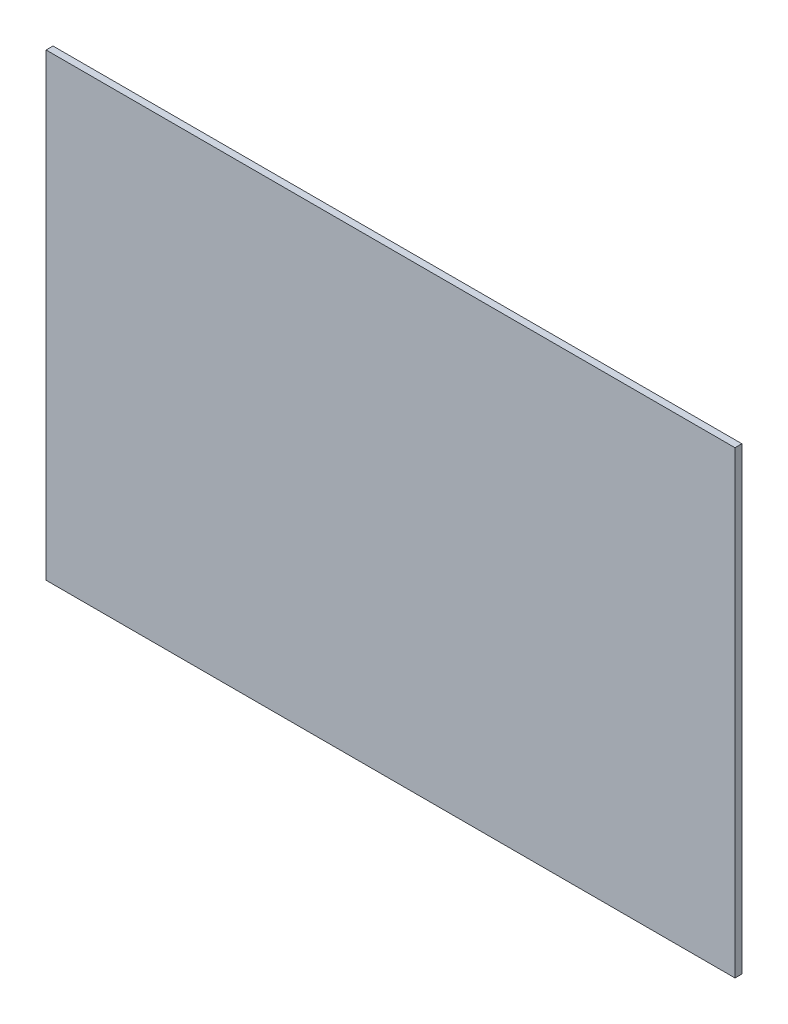
ISO-10303-21;
HEADER;
FILE_DESCRIPTION(('STEP AP214'),'2;1');
FILE_NAME('part.step','',(''),(''),'','','');
FILE_SCHEMA(('AUTOMOTIVE_DESIGN { 1 0 10303 214 1 1 1 1 }'));
ENDSEC;
DATA;
#1=APPLICATION_CONTEXT('core data for automotive mechanical design processes');
#2=APPLICATION_PROTOCOL_DEFINITION('international standard','automotive_design',2000,#1);
#3=PRODUCT_CONTEXT('',#1,'mechanical');
#4=PRODUCT('Part','Part','',(#3));
#5=PRODUCT_RELATED_PRODUCT_CATEGORY('part','',(#4));
#6=PRODUCT_DEFINITION_FORMATION('','',#4);
#7=PRODUCT_DEFINITION_CONTEXT('part definition',#1,'design');
#8=PRODUCT_DEFINITION('design','',#6,#7);
#9=PRODUCT_DEFINITION_SHAPE('','',#8);
#10=(LENGTH_UNIT() NAMED_UNIT(*) SI_UNIT(.MILLI.,.METRE.));
#11=(NAMED_UNIT(*) PLANE_ANGLE_UNIT() SI_UNIT($,.RADIAN.));
#12=(NAMED_UNIT(*) SI_UNIT($,.STERADIAN.) SOLID_ANGLE_UNIT());
#13=UNCERTAINTY_MEASURE_WITH_UNIT(LENGTH_MEASURE(1.E-05),#10,'distance_accuracy_value','');
#14=(GEOMETRIC_REPRESENTATION_CONTEXT(3) GLOBAL_UNCERTAINTY_ASSIGNED_CONTEXT((#13)) GLOBAL_UNIT_ASSIGNED_CONTEXT((#10,
#11,#12)) REPRESENTATION_CONTEXT('',''));
#15=CARTESIAN_POINT('',(0.,0.,0.));
#16=DIRECTION('',(0.,0.,1.));
#17=DIRECTION('',(1.,0.,0.));
#18=AXIS2_PLACEMENT_3D('',#15,#16,#17);
#19=CARTESIAN_POINT('',(0.,0.,6.));
#20=DIRECTION('',(1.,0.,0.));
#21=DIRECTION('',(0.,0.,-1.));
#22=AXIS2_PLACEMENT_3D('',#19,#20,#21);
#23=PLANE('',#22);
#24=DIRECTION('',(0.,-1.,0.));
#25=VECTOR('',#24,1.);
#26=CARTESIAN_POINT('',(0.,0.,0.));
#27=LINE('',#26,#25);
#28=CARTESIAN_POINT('',(0.,400.,0.));
#29=VERTEX_POINT('',#28);
#30=CARTESIAN_POINT('',(0.,0.,0.));
#31=VERTEX_POINT('',#30);
#32=EDGE_CURVE('E98',#29,#31,#27,.T.);
#33=ORIENTED_EDGE('',*,*,#32,.T.);
#34=DIRECTION('',(0.,0.,-1.));
#35=VECTOR('',#34,1.);
#36=CARTESIAN_POINT('',(0.,0.,6.));
#37=LINE('',#36,#35);
#38=CARTESIAN_POINT('',(0.,0.,6.));
#39=VERTEX_POINT('',#38);
#40=EDGE_CURVE('E11',#39,#31,#37,.T.);
#41=ORIENTED_EDGE('',*,*,#40,.F.);
#42=DIRECTION('',(0.,-1.,0.));
#43=VECTOR('',#42,1.);
#44=CARTESIAN_POINT('',(0.,0.,6.));
#45=LINE('',#44,#43);
#46=CARTESIAN_POINT('',(0.,400.,6.));
#47=VERTEX_POINT('',#46);
#48=EDGE_CURVE('E86',#47,#39,#45,.T.);
#49=ORIENTED_EDGE('',*,*,#48,.F.);
#50=DIRECTION('',(0.,0.,-1.));
#51=VECTOR('',#50,1.);
#52=CARTESIAN_POINT('',(0.,400.,6.));
#53=LINE('',#52,#51);
#54=EDGE_CURVE('E94',#47,#29,#53,.T.);
#55=ORIENTED_EDGE('',*,*,#54,.T.);
#56=EDGE_LOOP('',(#33,#41,#49,#55));
#57=FACE_BOUND('',#56,.T.);
#58=ADVANCED_FACE('F35',(#57),#23,.F.);
#59=CARTESIAN_POINT('',(0.,0.,6.));
#60=DIRECTION('',(0.,1.,0.));
#61=DIRECTION('',(0.,0.,1.));
#62=AXIS2_PLACEMENT_3D('',#59,#60,#61);
#63=PLANE('',#62);
#64=DIRECTION('',(1.,0.,0.));
#65=VECTOR('',#64,1.);
#66=CARTESIAN_POINT('',(0.,0.,0.));
#67=LINE('',#66,#65);
#68=CARTESIAN_POINT('',(600.,0.,0.));
#69=VERTEX_POINT('',#68);
#70=EDGE_CURVE('E90',#31,#69,#67,.T.);
#71=ORIENTED_EDGE('',*,*,#70,.T.);
#72=DIRECTION('',(0.,0.,-1.));
#73=VECTOR('',#72,1.);
#74=CARTESIAN_POINT('',(600.,0.,6.));
#75=LINE('',#74,#73);
#76=CARTESIAN_POINT('',(600.,0.,6.));
#77=VERTEX_POINT('',#76);
#78=EDGE_CURVE('E43',#77,#69,#75,.T.);
#79=ORIENTED_EDGE('',*,*,#78,.F.);
#80=DIRECTION('',(1.,0.,0.));
#81=VECTOR('',#80,1.);
#82=CARTESIAN_POINT('',(0.,0.,6.));
#83=LINE('',#82,#81);
#84=EDGE_CURVE('E81',#39,#77,#83,.T.);
#85=ORIENTED_EDGE('',*,*,#84,.F.);
#86=ORIENTED_EDGE('',*,*,#40,.T.);
#87=EDGE_LOOP('',(#71,#79,#85,#86));
#88=FACE_BOUND('',#87,.T.);
#89=ADVANCED_FACE('F89',(#88),#63,.F.);
#90=CARTESIAN_POINT('',(600.,0.,6.));
#91=DIRECTION('',(-1.,0.,0.));
#92=DIRECTION('',(0.,0.,1.));
#93=AXIS2_PLACEMENT_3D('',#90,#91,#92);
#94=PLANE('',#93);
#95=DIRECTION('',(0.,1.,0.));
#96=VECTOR('',#95,1.);
#97=CARTESIAN_POINT('',(600.,0.,0.));
#98=LINE('',#97,#96);
#99=CARTESIAN_POINT('',(600.,400.,0.));
#100=VERTEX_POINT('',#99);
#101=EDGE_CURVE('E68',#69,#100,#98,.T.);
#102=ORIENTED_EDGE('',*,*,#101,.T.);
#103=DIRECTION('',(0.,0.,-1.));
#104=VECTOR('',#103,1.);
#105=CARTESIAN_POINT('',(600.,400.,6.));
#106=LINE('',#105,#104);
#107=CARTESIAN_POINT('',(600.,400.,6.));
#108=VERTEX_POINT('',#107);
#109=EDGE_CURVE('E91',#108,#100,#106,.T.);
#110=ORIENTED_EDGE('',*,*,#109,.F.);
#111=DIRECTION('',(0.,1.,0.));
#112=VECTOR('',#111,1.);
#113=CARTESIAN_POINT('',(600.,0.,6.));
#114=LINE('',#113,#112);
#115=EDGE_CURVE('E84',#77,#108,#114,.T.);
#116=ORIENTED_EDGE('',*,*,#115,.F.);
#117=ORIENTED_EDGE('',*,*,#78,.T.);
#118=EDGE_LOOP('',(#102,#110,#116,#117));
#119=FACE_BOUND('',#118,.T.);
#120=ADVANCED_FACE('F92',(#119),#94,.F.);
#121=CARTESIAN_POINT('',(0.,400.,6.));
#122=DIRECTION('',(0.,-1.,0.));
#123=DIRECTION('',(0.,0.,-1.));
#124=AXIS2_PLACEMENT_3D('',#121,#122,#123);
#125=PLANE('',#124);
#126=DIRECTION('',(-1.,0.,0.));
#127=VECTOR('',#126,1.);
#128=CARTESIAN_POINT('',(0.,400.,0.));
#129=LINE('',#128,#127);
#130=EDGE_CURVE('E74',#100,#29,#129,.T.);
#131=ORIENTED_EDGE('',*,*,#130,.T.);
#132=ORIENTED_EDGE('',*,*,#54,.F.);
#133=DIRECTION('',(-1.,0.,0.));
#134=VECTOR('',#133,1.);
#135=CARTESIAN_POINT('',(0.,400.,6.));
#136=LINE('',#135,#134);
#137=EDGE_CURVE('E51',#108,#47,#136,.T.);
#138=ORIENTED_EDGE('',*,*,#137,.F.);
#139=ORIENTED_EDGE('',*,*,#109,.T.);
#140=EDGE_LOOP('',(#131,#132,#138,#139));
#141=FACE_BOUND('',#140,.T.);
#142=ADVANCED_FACE('F105',(#141),#125,.F.);
#143=CARTESIAN_POINT('',(0.,0.,6.));
#144=DIRECTION('',(0.,0.,-1.));
#145=DIRECTION('',(-1.,0.,0.));
#146=AXIS2_PLACEMENT_3D('',#143,#144,#145);
#147=PLANE('',#146);
#148=ORIENTED_EDGE('',*,*,#48,.T.);
#149=ORIENTED_EDGE('',*,*,#84,.T.);
#150=ORIENTED_EDGE('',*,*,#115,.T.);
#151=ORIENTED_EDGE('',*,*,#137,.T.);
#152=EDGE_LOOP('',(#148,#149,#150,#151));
#153=FACE_BOUND('',#152,.T.);
#154=ADVANCED_FACE('F82',(#153),#147,.F.);
#155=CARTESIAN_POINT('',(0.,0.,0.));
#156=DIRECTION('',(0.,0.,-1.));
#157=DIRECTION('',(-1.,0.,0.));
#158=AXIS2_PLACEMENT_3D('',#155,#156,#157);
#159=PLANE('',#158);
#160=ORIENTED_EDGE('',*,*,#32,.F.);
#161=ORIENTED_EDGE('',*,*,#130,.F.);
#162=ORIENTED_EDGE('',*,*,#101,.F.);
#163=ORIENTED_EDGE('',*,*,#70,.F.);
#164=EDGE_LOOP('',(#160,#161,#162,#163));
#165=FACE_BOUND('',#164,.T.);
#166=ADVANCED_FACE('F108',(#165),#159,.T.);
#167=CLOSED_SHELL('',(#58,#89,#120,#142,#154,#166));
#168=MANIFOLD_SOLID_BREP('B2',#167);
#169=ADVANCED_BREP_SHAPE_REPRESENTATION('',(#18,#168),#14);
#170=SHAPE_DEFINITION_REPRESENTATION(#9,#169);
ENDSEC;
END-ISO-10303-21;
